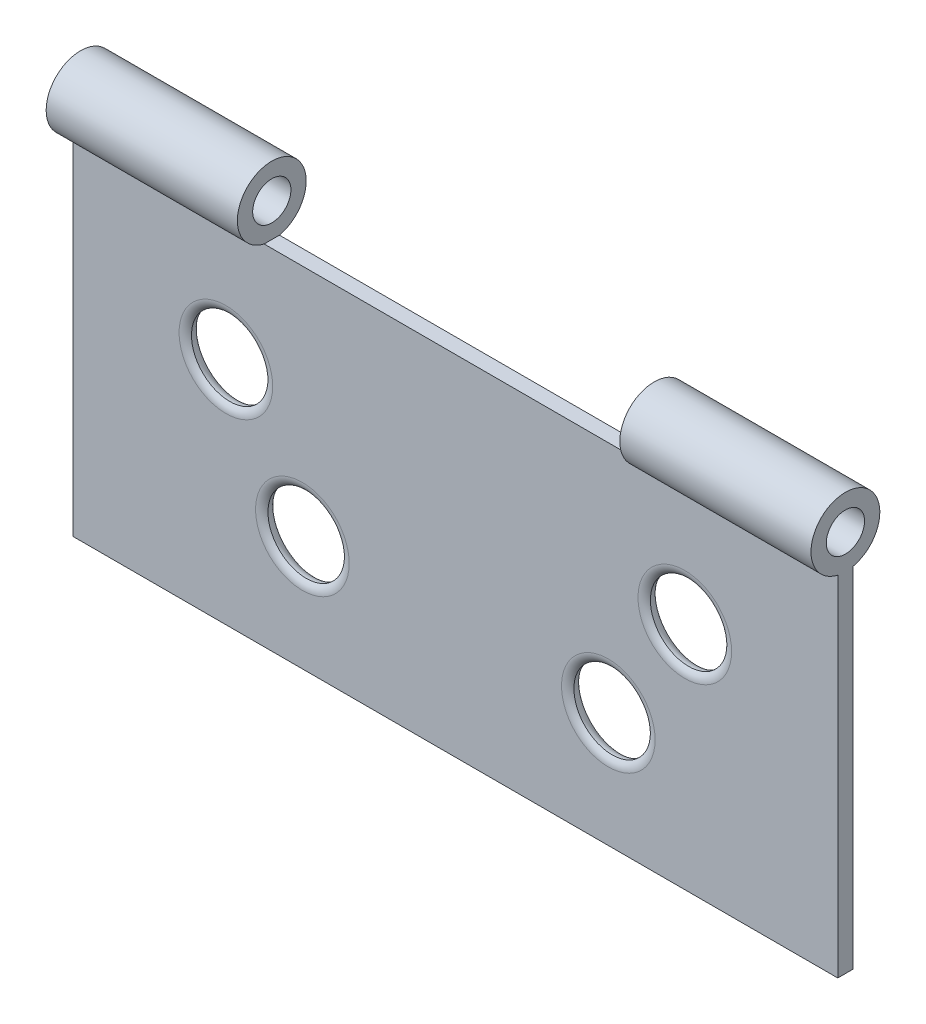
ISO-10303-21;
HEADER;
FILE_DESCRIPTION(('STEP AP214'),'2;1');
FILE_NAME('part.step','',(''),(''),'','','');
FILE_SCHEMA(('AUTOMOTIVE_DESIGN { 1 0 10303 214 1 1 1 1 }'));
ENDSEC;
DATA;
#1=APPLICATION_CONTEXT('core data for automotive mechanical design processes');
#2=APPLICATION_PROTOCOL_DEFINITION('international standard','automotive_design',2000,#1);
#3=PRODUCT_CONTEXT('',#1,'mechanical');
#4=PRODUCT('Part','Part','',(#3));
#5=PRODUCT_RELATED_PRODUCT_CATEGORY('part','',(#4));
#6=PRODUCT_DEFINITION_FORMATION('','',#4);
#7=PRODUCT_DEFINITION_CONTEXT('part definition',#1,'design');
#8=PRODUCT_DEFINITION('design','',#6,#7);
#9=PRODUCT_DEFINITION_SHAPE('','',#8);
#10=(LENGTH_UNIT() NAMED_UNIT(*) SI_UNIT(.MILLI.,.METRE.));
#11=(NAMED_UNIT(*) PLANE_ANGLE_UNIT() SI_UNIT($,.RADIAN.));
#12=(NAMED_UNIT(*) SI_UNIT($,.STERADIAN.) SOLID_ANGLE_UNIT());
#13=UNCERTAINTY_MEASURE_WITH_UNIT(LENGTH_MEASURE(1.E-05),#10,'distance_accuracy_value','');
#14=(GEOMETRIC_REPRESENTATION_CONTEXT(3) GLOBAL_UNCERTAINTY_ASSIGNED_CONTEXT((#13)) GLOBAL_UNIT_ASSIGNED_CONTEXT((#10,
#11,#12)) REPRESENTATION_CONTEXT('',''));
#15=CARTESIAN_POINT('',(0.,0.,0.));
#16=DIRECTION('',(0.,0.,1.));
#17=DIRECTION('',(1.,0.,0.));
#18=AXIS2_PLACEMENT_3D('',#15,#16,#17);
#19=CARTESIAN_POINT('',(-19.6928853558979,8.1864989832161,0.1));
#20=DIRECTION('',(1.,0.,0.));
#21=DIRECTION('',(0.,0.,-1.));
#22=AXIS2_PLACEMENT_3D('',#19,#20,#21);
#23=CYLINDRICAL_SURFACE('',#22,0.450000000000002);
#24=DIRECTION('',(1.,0.,0.));
#25=VECTOR('',#24,1.);
#26=CARTESIAN_POINT('',(-19.6928853558979,7.74775076384649,0.2));
#27=LINE('',#26,#25);
#28=CARTESIAN_POINT('',(-19.6928853558979,7.74775076384649,0.2));
#29=VERTEX_POINT('',#28);
#30=CARTESIAN_POINT('',(-17.1928853558979,7.74775076384649,0.199999999999999));
#31=VERTEX_POINT('',#30);
#32=EDGE_CURVE('E132',#29,#31,#27,.T.);
#33=ORIENTED_EDGE('',*,*,#32,.T.);
#34=CARTESIAN_POINT('',(-17.1928853558979,8.1864989832161,0.1));
#35=DIRECTION('',(1.,0.,0.));
#36=DIRECTION('',(0.,0.,-1.));
#37=AXIS2_PLACEMENT_3D('',#34,#35,#36);
#38=CIRCLE('',#37,0.450000000000002);
#39=CARTESIAN_POINT('',(-17.1928853558979,7.74775076384649,0.));
#40=VERTEX_POINT('',#39);
#41=EDGE_CURVE('E119',#31,#40,#38,.F.);
#42=ORIENTED_EDGE('',*,*,#41,.T.);
#43=DIRECTION('',(1.,0.,0.));
#44=VECTOR('',#43,1.);
#45=CARTESIAN_POINT('',(-19.6928853558979,7.74775076384649,0.));
#46=LINE('',#45,#44);
#47=CARTESIAN_POINT('',(-19.6928853558979,7.74775076384649,0.));
#48=VERTEX_POINT('',#47);
#49=EDGE_CURVE('E11',#48,#40,#46,.T.);
#50=ORIENTED_EDGE('',*,*,#49,.F.);
#51=CARTESIAN_POINT('',(-19.6928853558979,8.1864989832161,0.1));
#52=DIRECTION('',(1.,0.,0.));
#53=DIRECTION('',(0.,0.,-1.));
#54=AXIS2_PLACEMENT_3D('',#51,#52,#53);
#55=CIRCLE('',#54,0.450000000000002);
#56=EDGE_CURVE('E128',#48,#29,#55,.T.);
#57=ORIENTED_EDGE('',*,*,#56,.T.);
#58=EDGE_LOOP('',(#33,#42,#50,#57));
#59=FACE_BOUND('',#58,.T.);
#60=ADVANCED_FACE('F34',(#59),#23,.T.);
#61=CARTESIAN_POINT('',(-19.6928853558979,8.1864989832161,0.1));
#62=DIRECTION('',(1.,0.,0.));
#63=DIRECTION('',(0.,0.,-1.));
#64=AXIS2_PLACEMENT_3D('',#61,#62,#63);
#65=CYLINDRICAL_SURFACE('',#64,0.250000000000001);
#66=CARTESIAN_POINT('',(-19.6928853558979,8.1864989832161,0.1));
#67=DIRECTION('',(1.,0.,0.));
#68=DIRECTION('',(0.,0.,-1.));
#69=AXIS2_PLACEMENT_3D('',#66,#67,#68);
#70=CIRCLE('',#69,0.250000000000001);
#71=CARTESIAN_POINT('',(-19.6928853558979,8.1864989832161,-0.150000000000001));
#72=VERTEX_POINT('',#71);
#73=EDGE_CURVE('E123',#72,#72,#70,.T.);
#74=ORIENTED_EDGE('',*,*,#73,.F.);
#75=EDGE_LOOP('',(#74));
#76=FACE_BOUND('',#75,.T.);
#77=CARTESIAN_POINT('',(-17.1928853558979,8.1864989832161,0.1));
#78=DIRECTION('',(1.,0.,0.));
#79=DIRECTION('',(0.,0.,-1.));
#80=AXIS2_PLACEMENT_3D('',#77,#78,#79);
#81=CIRCLE('',#80,0.250000000000001);
#82=CARTESIAN_POINT('',(-17.1928853558979,8.1864989832161,-0.150000000000001));
#83=VERTEX_POINT('',#82);
#84=EDGE_CURVE('E38',#83,#83,#81,.F.);
#85=ORIENTED_EDGE('',*,*,#84,.F.);
#86=EDGE_LOOP('',(#85));
#87=FACE_BOUND('',#86,.T.);
#88=ADVANCED_FACE('F222',(#76,#87),#65,.F.);
#89=CARTESIAN_POINT('',(-19.6928853558979,0.,0.2));
#90=DIRECTION('',(1.,0.,0.));
#91=DIRECTION('',(0.,0.,-1.));
#92=AXIS2_PLACEMENT_3D('',#89,#90,#91);
#93=PLANE('',#92);
#94=DIRECTION('',(0.,-1.,0.));
#95=VECTOR('',#94,1.);
#96=CARTESIAN_POINT('',(-19.6928853558979,0.,0.2));
#97=LINE('',#96,#95);
#98=CARTESIAN_POINT('',(-19.6928853558979,3.1864989832161,0.2));
#99=VERTEX_POINT('',#98);
#100=EDGE_CURVE('E135',#29,#99,#97,.T.);
#101=ORIENTED_EDGE('',*,*,#100,.F.);
#102=ORIENTED_EDGE('',*,*,#56,.F.);
#103=DIRECTION('',(0.,-1.,0.));
#104=VECTOR('',#103,1.);
#105=CARTESIAN_POINT('',(-19.6928853558979,0.,0.));
#106=LINE('',#105,#104);
#107=CARTESIAN_POINT('',(-19.6928853558979,3.1864989832161,0.));
#108=VERTEX_POINT('',#107);
#109=EDGE_CURVE('E58',#48,#108,#106,.T.);
#110=ORIENTED_EDGE('',*,*,#109,.T.);
#111=DIRECTION('',(0.,0.,-1.));
#112=VECTOR('',#111,1.);
#113=CARTESIAN_POINT('',(-19.6928853558979,3.1864989832161,0.2));
#114=LINE('',#113,#112);
#115=EDGE_CURVE('E150',#99,#108,#114,.T.);
#116=ORIENTED_EDGE('',*,*,#115,.F.);
#117=EDGE_LOOP('',(#101,#102,#110,#116));
#118=FACE_BOUND('',#117,.T.);
#119=ORIENTED_EDGE('',*,*,#73,.T.);
#120=EDGE_LOOP('',(#119));
#121=FACE_BOUND('',#120,.T.);
#122=ADVANCED_FACE('F228',(#118,#121),#93,.F.);
#123=CARTESIAN_POINT('',(-9.69288535589785,0.,0.2));
#124=DIRECTION('',(1.,0.,0.));
#125=DIRECTION('',(0.,0.,-1.));
#126=AXIS2_PLACEMENT_3D('',#123,#124,#125);
#127=PLANE('',#126);
#128=DIRECTION('',(0.,-1.,0.));
#129=VECTOR('',#128,1.);
#130=CARTESIAN_POINT('',(-9.69288535589785,0.,0.));
#131=LINE('',#130,#129);
#132=CARTESIAN_POINT('',(-9.69288535589785,7.74775076384649,0.));
#133=VERTEX_POINT('',#132);
#134=CARTESIAN_POINT('',(-9.69288535589785,3.1864989832161,0.));
#135=VERTEX_POINT('',#134);
#136=EDGE_CURVE('E138',#133,#135,#131,.T.);
#137=ORIENTED_EDGE('',*,*,#136,.F.);
#138=CARTESIAN_POINT('',(-9.69288535589785,8.1864989832161,0.1));
#139=DIRECTION('',(1.,0.,0.));
#140=DIRECTION('',(0.,0.,-1.));
#141=AXIS2_PLACEMENT_3D('',#138,#139,#140);
#142=CIRCLE('',#141,0.450000000000002);
#143=CARTESIAN_POINT('',(-9.69288535589785,7.74775076384649,0.2));
#144=VERTEX_POINT('',#143);
#145=EDGE_CURVE('E108',#133,#144,#142,.T.);
#146=ORIENTED_EDGE('',*,*,#145,.T.);
#147=DIRECTION('',(0.,-1.,0.));
#148=VECTOR('',#147,1.);
#149=CARTESIAN_POINT('',(-9.69288535589785,0.,0.2));
#150=LINE('',#149,#148);
#151=CARTESIAN_POINT('',(-9.69288535589785,3.1864989832161,0.2));
#152=VERTEX_POINT('',#151);
#153=EDGE_CURVE('E141',#144,#152,#150,.T.);
#154=ORIENTED_EDGE('',*,*,#153,.T.);
#155=DIRECTION('',(0.,0.,-1.));
#156=VECTOR('',#155,1.);
#157=CARTESIAN_POINT('',(-9.69288535589785,3.1864989832161,0.2));
#158=LINE('',#157,#156);
#159=EDGE_CURVE('E143',#152,#135,#158,.T.);
#160=ORIENTED_EDGE('',*,*,#159,.T.);
#161=EDGE_LOOP('',(#137,#146,#154,#160));
#162=FACE_BOUND('',#161,.T.);
#163=CARTESIAN_POINT('',(-9.69288535589785,8.1864989832161,0.1));
#164=DIRECTION('',(1.,0.,0.));
#165=DIRECTION('',(0.,0.,-1.));
#166=AXIS2_PLACEMENT_3D('',#163,#164,#165);
#167=CIRCLE('',#166,0.250000000000001);
#168=CARTESIAN_POINT('',(-9.69288535589785,8.1864989832161,-0.150000000000001));
#169=VERTEX_POINT('',#168);
#170=EDGE_CURVE('E122',#169,#169,#167,.T.);
#171=ORIENTED_EDGE('',*,*,#170,.F.);
#172=EDGE_LOOP('',(#171));
#173=FACE_BOUND('',#172,.T.);
#174=ADVANCED_FACE('F266',(#162,#173),#127,.T.);
#175=CARTESIAN_POINT('',(0.,3.1864989832161,0.2));
#176=DIRECTION('',(0.,-1.,0.));
#177=DIRECTION('',(0.,0.,-1.));
#178=AXIS2_PLACEMENT_3D('',#175,#176,#177);
#179=PLANE('',#178);
#180=DIRECTION('',(-1.,0.,0.));
#181=VECTOR('',#180,1.);
#182=CARTESIAN_POINT('',(0.,3.1864989832161,0.));
#183=LINE('',#182,#181);
#184=EDGE_CURVE('E145',#135,#108,#183,.T.);
#185=ORIENTED_EDGE('',*,*,#184,.F.);
#186=ORIENTED_EDGE('',*,*,#159,.F.);
#187=DIRECTION('',(-1.,0.,0.));
#188=VECTOR('',#187,1.);
#189=CARTESIAN_POINT('',(0.,3.1864989832161,0.2));
#190=LINE('',#189,#188);
#191=EDGE_CURVE('E137',#152,#99,#190,.T.);
#192=ORIENTED_EDGE('',*,*,#191,.T.);
#193=ORIENTED_EDGE('',*,*,#115,.T.);
#194=EDGE_LOOP('',(#185,#186,#192,#193));
#195=FACE_BOUND('',#194,.T.);
#196=ADVANCED_FACE('F216',(#195),#179,.T.);
#197=CARTESIAN_POINT('',(0.,0.,0.2));
#198=DIRECTION('',(0.,0.,1.));
#199=DIRECTION('',(1.,0.,0.));
#200=AXIS2_PLACEMENT_3D('',#197,#198,#199);
#201=PLANE('',#200);
#202=ORIENTED_EDGE('',*,*,#32,.F.);
#203=ORIENTED_EDGE('',*,*,#100,.T.);
#204=ORIENTED_EDGE('',*,*,#191,.F.);
#205=ORIENTED_EDGE('',*,*,#153,.F.);
#206=CARTESIAN_POINT('',(-12.1928853558979,7.74775076384649,0.2));
#207=VERTEX_POINT('',#206);
#208=EDGE_CURVE('E130',#207,#144,#27,.T.);
#209=ORIENTED_EDGE('',*,*,#208,.F.);
#210=EDGE_CURVE('E102',#31,#207,#27,.T.);
#211=ORIENTED_EDGE('',*,*,#210,.F.);
#212=EDGE_LOOP('',(#202,#203,#204,#205,#209,#211));
#213=FACE_BOUND('',#212,.T.);
#214=CARTESIAN_POINT('',(-11.6928853558979,6.18958373985024,0.2));
#215=DIRECTION('',(0.,0.,1.));
#216=DIRECTION('',(1.,0.,0.));
#217=AXIS2_PLACEMENT_3D('',#214,#215,#216);
#218=CIRCLE('',#217,0.61180339887499);
#219=CARTESIAN_POINT('',(-11.0810819570229,6.18958373985024,0.2));
#220=VERTEX_POINT('',#219);
#221=EDGE_CURVE('E110',#220,#220,#218,.F.);
#222=ORIENTED_EDGE('',*,*,#221,.T.);
#223=EDGE_LOOP('',(#222));
#224=FACE_BOUND('',#223,.T.);
#225=CARTESIAN_POINT('',(-12.6928853558979,4.68804136153317,0.2));
#226=DIRECTION('',(0.,0.,1.));
#227=DIRECTION('',(1.,0.,0.));
#228=AXIS2_PLACEMENT_3D('',#225,#226,#227);
#229=CIRCLE('',#228,0.61180339887499);
#230=CARTESIAN_POINT('',(-12.0810819570229,4.68804136153317,0.2));
#231=VERTEX_POINT('',#230);
#232=EDGE_CURVE('E182',#231,#231,#229,.F.);
#233=ORIENTED_EDGE('',*,*,#232,.T.);
#234=EDGE_LOOP('',(#233));
#235=FACE_BOUND('',#234,.T.);
#236=CARTESIAN_POINT('',(-17.6928853558979,6.18958373985024,0.2));
#237=DIRECTION('',(0.,0.,1.));
#238=DIRECTION('',(1.,0.,0.));
#239=AXIS2_PLACEMENT_3D('',#236,#237,#238);
#240=CIRCLE('',#239,0.611803398874989);
#241=CARTESIAN_POINT('',(-17.0810819570229,6.18958373985024,0.2));
#242=VERTEX_POINT('',#241);
#243=EDGE_CURVE('E180',#242,#242,#240,.F.);
#244=ORIENTED_EDGE('',*,*,#243,.T.);
#245=EDGE_LOOP('',(#244));
#246=FACE_BOUND('',#245,.T.);
#247=CARTESIAN_POINT('',(-16.6928853558979,4.6864989832161,0.2));
#248=DIRECTION('',(0.,0.,1.));
#249=DIRECTION('',(1.,0.,0.));
#250=AXIS2_PLACEMENT_3D('',#247,#248,#249);
#251=CIRCLE('',#250,0.611803398874989);
#252=CARTESIAN_POINT('',(-16.0810819570229,4.6864989832161,0.2));
#253=VERTEX_POINT('',#252);
#254=EDGE_CURVE('E177',#253,#253,#251,.F.);
#255=ORIENTED_EDGE('',*,*,#254,.T.);
#256=EDGE_LOOP('',(#255));
#257=FACE_BOUND('',#256,.T.);
#258=ADVANCED_FACE('F189',(#213,#224,#235,#246,#257),#201,.T.);
#259=CARTESIAN_POINT('',(0.,0.,0.));
#260=DIRECTION('',(0.,0.,1.));
#261=DIRECTION('',(1.,0.,0.));
#262=AXIS2_PLACEMENT_3D('',#259,#260,#261);
#263=PLANE('',#262);
#264=CARTESIAN_POINT('',(-16.6928853558979,4.6864989832161,0.));
#265=DIRECTION('',(0.,0.,1.));
#266=DIRECTION('',(1.,0.,0.));
#267=AXIS2_PLACEMENT_3D('',#264,#265,#266);
#268=CIRCLE('',#267,0.649999999999999);
#269=CARTESIAN_POINT('',(-16.0428853558979,4.6864989832161,0.));
#270=VERTEX_POINT('',#269);
#271=EDGE_CURVE('E162',#270,#270,#268,.T.);
#272=ORIENTED_EDGE('',*,*,#271,.T.);
#273=EDGE_LOOP('',(#272));
#274=FACE_BOUND('',#273,.T.);
#275=CARTESIAN_POINT('',(-17.6928853558979,6.18958373985024,0.));
#276=DIRECTION('',(0.,0.,1.));
#277=DIRECTION('',(1.,0.,0.));
#278=AXIS2_PLACEMENT_3D('',#275,#276,#277);
#279=CIRCLE('',#278,0.649999999999999);
#280=CARTESIAN_POINT('',(-17.0428853558979,6.18958373985024,0.));
#281=VERTEX_POINT('',#280);
#282=EDGE_CURVE('E159',#281,#281,#279,.T.);
#283=ORIENTED_EDGE('',*,*,#282,.T.);
#284=EDGE_LOOP('',(#283));
#285=FACE_BOUND('',#284,.T.);
#286=CARTESIAN_POINT('',(-12.6928853558979,4.68804136153317,0.));
#287=DIRECTION('',(0.,0.,1.));
#288=DIRECTION('',(1.,0.,0.));
#289=AXIS2_PLACEMENT_3D('',#286,#287,#288);
#290=CIRCLE('',#289,0.650000000000001);
#291=CARTESIAN_POINT('',(-12.0428853558979,4.68804136153317,0.));
#292=VERTEX_POINT('',#291);
#293=EDGE_CURVE('E156',#292,#292,#290,.T.);
#294=ORIENTED_EDGE('',*,*,#293,.T.);
#295=EDGE_LOOP('',(#294));
#296=FACE_BOUND('',#295,.T.);
#297=CARTESIAN_POINT('',(-11.6928853558979,6.18958373985024,0.));
#298=DIRECTION('',(0.,0.,1.));
#299=DIRECTION('',(1.,0.,0.));
#300=AXIS2_PLACEMENT_3D('',#297,#298,#299);
#301=CIRCLE('',#300,0.650000000000001);
#302=CARTESIAN_POINT('',(-11.0428853558979,6.18958373985024,0.));
#303=VERTEX_POINT('',#302);
#304=EDGE_CURVE('E153',#303,#303,#301,.T.);
#305=ORIENTED_EDGE('',*,*,#304,.T.);
#306=EDGE_LOOP('',(#305));
#307=FACE_BOUND('',#306,.T.);
#308=ORIENTED_EDGE('',*,*,#109,.F.);
#309=ORIENTED_EDGE('',*,*,#49,.T.);
#310=CARTESIAN_POINT('',(-12.1928853558979,7.74775076384649,0.));
#311=VERTEX_POINT('',#310);
#312=EDGE_CURVE('E43',#40,#311,#46,.T.);
#313=ORIENTED_EDGE('',*,*,#312,.T.);
#314=EDGE_CURVE('E45',#311,#133,#46,.T.);
#315=ORIENTED_EDGE('',*,*,#314,.T.);
#316=ORIENTED_EDGE('',*,*,#136,.T.);
#317=ORIENTED_EDGE('',*,*,#184,.T.);
#318=EDGE_LOOP('',(#308,#309,#313,#315,#316,#317));
#319=FACE_BOUND('',#318,.T.);
#320=ADVANCED_FACE('F111',(#274,#285,#296,#307,#319),#263,.F.);
#321=CARTESIAN_POINT('',(-16.6928853558979,4.6864989832161,0.15));
#322=DIRECTION('',(0.,0.,1.));
#323=DIRECTION('',(1.,0.,0.));
#324=AXIS2_PLACEMENT_3D('',#321,#322,#323);
#325=TOROIDAL_SURFACE('',#324,0.649999999999999,0.15);
#326=CARTESIAN_POINT('',(-16.6928853558979,4.6864989832161,0.15));
#327=DIRECTION('',(0.,0.,1.));
#328=DIRECTION('',(1.,0.,0.));
#329=AXIS2_PLACEMENT_3D('',#326,#327,#328);
#330=CIRCLE('',#329,0.499999999999999);
#331=CARTESIAN_POINT('',(-16.1928853558979,4.6864989832161,0.15));
#332=VERTEX_POINT('',#331);
#333=EDGE_CURVE('E165',#332,#332,#330,.F.);
#334=ORIENTED_EDGE('',*,*,#333,.F.);
#335=EDGE_LOOP('',(#334));
#336=FACE_BOUND('',#335,.T.);
#337=ORIENTED_EDGE('',*,*,#271,.F.);
#338=EDGE_LOOP('',(#337));
#339=FACE_BOUND('',#338,.T.);
#340=ADVANCED_FACE('F206',(#336,#339),#325,.T.);
#341=CARTESIAN_POINT('',(-17.6928853558979,6.18958373985024,0.15));
#342=DIRECTION('',(0.,0.,1.));
#343=DIRECTION('',(1.,0.,0.));
#344=AXIS2_PLACEMENT_3D('',#341,#342,#343);
#345=TOROIDAL_SURFACE('',#344,0.649999999999999,0.15);
#346=CARTESIAN_POINT('',(-17.6928853558979,6.18958373985024,0.15));
#347=DIRECTION('',(0.,0.,1.));
#348=DIRECTION('',(1.,0.,0.));
#349=AXIS2_PLACEMENT_3D('',#346,#347,#348);
#350=CIRCLE('',#349,0.499999999999999);
#351=CARTESIAN_POINT('',(-17.1928853558979,6.18958373985024,0.15));
#352=VERTEX_POINT('',#351);
#353=EDGE_CURVE('E168',#352,#352,#350,.F.);
#354=ORIENTED_EDGE('',*,*,#353,.F.);
#355=EDGE_LOOP('',(#354));
#356=FACE_BOUND('',#355,.T.);
#357=ORIENTED_EDGE('',*,*,#282,.F.);
#358=EDGE_LOOP('',(#357));
#359=FACE_BOUND('',#358,.T.);
#360=ADVANCED_FACE('F213',(#356,#359),#345,.T.);
#361=CARTESIAN_POINT('',(-12.6928853558979,4.68804136153317,0.15));
#362=DIRECTION('',(0.,0.,1.));
#363=DIRECTION('',(1.,0.,0.));
#364=AXIS2_PLACEMENT_3D('',#361,#362,#363);
#365=TOROIDAL_SURFACE('',#364,0.650000000000001,0.15);
#366=CARTESIAN_POINT('',(-12.6928853558979,4.68804136153317,0.15));
#367=DIRECTION('',(0.,0.,1.));
#368=DIRECTION('',(1.,0.,0.));
#369=AXIS2_PLACEMENT_3D('',#366,#367,#368);
#370=CIRCLE('',#369,0.500000000000001);
#371=CARTESIAN_POINT('',(-12.1928853558979,4.68804136153317,0.15));
#372=VERTEX_POINT('',#371);
#373=EDGE_CURVE('E171',#372,#372,#370,.F.);
#374=ORIENTED_EDGE('',*,*,#373,.F.);
#375=EDGE_LOOP('',(#374));
#376=FACE_BOUND('',#375,.T.);
#377=ORIENTED_EDGE('',*,*,#293,.F.);
#378=EDGE_LOOP('',(#377));
#379=FACE_BOUND('',#378,.T.);
#380=ADVANCED_FACE('F201',(#376,#379),#365,.T.);
#381=CARTESIAN_POINT('',(-11.6928853558979,6.18958373985024,0.15));
#382=DIRECTION('',(0.,0.,1.));
#383=DIRECTION('',(1.,0.,0.));
#384=AXIS2_PLACEMENT_3D('',#381,#382,#383);
#385=TOROIDAL_SURFACE('',#384,0.650000000000001,0.15);
#386=CARTESIAN_POINT('',(-11.6928853558979,6.18958373985024,0.15));
#387=DIRECTION('',(0.,0.,1.));
#388=DIRECTION('',(1.,0.,0.));
#389=AXIS2_PLACEMENT_3D('',#386,#387,#388);
#390=CIRCLE('',#389,0.500000000000001);
#391=CARTESIAN_POINT('',(-11.1928853558979,6.18958373985024,0.15));
#392=VERTEX_POINT('',#391);
#393=EDGE_CURVE('E174',#392,#392,#390,.F.);
#394=ORIENTED_EDGE('',*,*,#393,.F.);
#395=EDGE_LOOP('',(#394));
#396=FACE_BOUND('',#395,.T.);
#397=ORIENTED_EDGE('',*,*,#304,.F.);
#398=EDGE_LOOP('',(#397));
#399=FACE_BOUND('',#398,.T.);
#400=ADVANCED_FACE('F195',(#396,#399),#385,.T.);
#401=CARTESIAN_POINT('',(-11.6928853558979,6.18958373985024,0.05));
#402=DIRECTION('',(0.,0.,1.));
#403=DIRECTION('',(1.,0.,0.));
#404=AXIS2_PLACEMENT_3D('',#401,#402,#403);
#405=TOROIDAL_SURFACE('',#404,0.61180339887499,0.15);
#406=ORIENTED_EDGE('',*,*,#221,.F.);
#407=EDGE_LOOP('',(#406));
#408=FACE_BOUND('',#407,.T.);
#409=ORIENTED_EDGE('',*,*,#393,.T.);
#410=EDGE_LOOP('',(#409));
#411=FACE_BOUND('',#410,.T.);
#412=ADVANCED_FACE('F191',(#408,#411),#405,.T.);
#413=CARTESIAN_POINT('',(-12.6928853558979,4.68804136153317,0.05));
#414=DIRECTION('',(0.,0.,1.));
#415=DIRECTION('',(1.,0.,0.));
#416=AXIS2_PLACEMENT_3D('',#413,#414,#415);
#417=TOROIDAL_SURFACE('',#416,0.61180339887499,0.15);
#418=ORIENTED_EDGE('',*,*,#232,.F.);
#419=EDGE_LOOP('',(#418));
#420=FACE_BOUND('',#419,.T.);
#421=ORIENTED_EDGE('',*,*,#373,.T.);
#422=EDGE_LOOP('',(#421));
#423=FACE_BOUND('',#422,.T.);
#424=ADVANCED_FACE('F194',(#420,#423),#417,.T.);
#425=CARTESIAN_POINT('',(-17.6928853558979,6.18958373985024,0.05));
#426=DIRECTION('',(0.,0.,1.));
#427=DIRECTION('',(1.,0.,0.));
#428=AXIS2_PLACEMENT_3D('',#425,#426,#427);
#429=TOROIDAL_SURFACE('',#428,0.611803398874989,0.15);
#430=ORIENTED_EDGE('',*,*,#243,.F.);
#431=EDGE_LOOP('',(#430));
#432=FACE_BOUND('',#431,.T.);
#433=ORIENTED_EDGE('',*,*,#353,.T.);
#434=EDGE_LOOP('',(#433));
#435=FACE_BOUND('',#434,.T.);
#436=ADVANCED_FACE('F238',(#432,#435),#429,.T.);
#437=CARTESIAN_POINT('',(-16.6928853558979,4.6864989832161,0.05));
#438=DIRECTION('',(0.,0.,1.));
#439=DIRECTION('',(1.,0.,0.));
#440=AXIS2_PLACEMENT_3D('',#437,#438,#439);
#441=TOROIDAL_SURFACE('',#440,0.611803398874989,0.15);
#442=ORIENTED_EDGE('',*,*,#254,.F.);
#443=EDGE_LOOP('',(#442));
#444=FACE_BOUND('',#443,.T.);
#445=ORIENTED_EDGE('',*,*,#333,.T.);
#446=EDGE_LOOP('',(#445));
#447=FACE_BOUND('',#446,.T.);
#448=ADVANCED_FACE('F36',(#444,#447),#441,.T.);
#449=CARTESIAN_POINT('',(-12.1928853558979,8.1864989832161,0.1));
#450=DIRECTION('',(1.,0.,0.));
#451=DIRECTION('',(0.,0.,-1.));
#452=AXIS2_PLACEMENT_3D('',#449,#450,#451);
#453=CIRCLE('',#452,0.450000000000002);
#454=EDGE_CURVE('E88',#207,#311,#453,.F.);
#455=ORIENTED_EDGE('',*,*,#454,.F.);
#456=ORIENTED_EDGE('',*,*,#208,.T.);
#457=ORIENTED_EDGE('',*,*,#145,.F.);
#458=ORIENTED_EDGE('',*,*,#314,.F.);
#459=EDGE_LOOP('',(#455,#456,#457,#458));
#460=FACE_BOUND('',#459,.T.);
#461=ADVANCED_FACE('F106',(#460),#23,.T.);
#462=CARTESIAN_POINT('',(-12.1928853558979,8.1864989832161,0.1));
#463=DIRECTION('',(1.,0.,0.));
#464=DIRECTION('',(0.,0.,-1.));
#465=AXIS2_PLACEMENT_3D('',#462,#463,#464);
#466=CIRCLE('',#465,0.250000000000001);
#467=CARTESIAN_POINT('',(-12.1928853558979,8.1864989832161,-0.150000000000001));
#468=VERTEX_POINT('',#467);
#469=EDGE_CURVE('E94',#468,#468,#466,.F.);
#470=ORIENTED_EDGE('',*,*,#469,.T.);
#471=EDGE_LOOP('',(#470));
#472=FACE_BOUND('',#471,.T.);
#473=ORIENTED_EDGE('',*,*,#170,.T.);
#474=EDGE_LOOP('',(#473));
#475=FACE_BOUND('',#474,.T.);
#476=ADVANCED_FACE('F231',(#472,#475),#65,.F.);
#477=CARTESIAN_POINT('',(-17.1928853558979,0.,-10.));
#478=DIRECTION('',(1.,0.,0.));
#479=DIRECTION('',(0.,0.,-1.));
#480=AXIS2_PLACEMENT_3D('',#477,#478,#479);
#481=PLANE('',#480);
#482=DIRECTION('',(0.,0.,1.));
#483=VECTOR('',#482,1.);
#484=CARTESIAN_POINT('',(-17.1928853558979,7.74775076384649,-10.));
#485=LINE('',#484,#483);
#486=EDGE_CURVE('E103',#40,#31,#485,.T.);
#487=ORIENTED_EDGE('',*,*,#486,.F.);
#488=ORIENTED_EDGE('',*,*,#41,.F.);
#489=EDGE_LOOP('',(#487,#488));
#490=FACE_BOUND('',#489,.T.);
#491=ORIENTED_EDGE('',*,*,#84,.T.);
#492=EDGE_LOOP('',(#491));
#493=FACE_BOUND('',#492,.T.);
#494=ADVANCED_FACE('F237',(#490,#493),#481,.T.);
#495=CARTESIAN_POINT('',(-12.1928853558979,0.,-10.));
#496=DIRECTION('',(1.,0.,0.));
#497=DIRECTION('',(0.,0.,-1.));
#498=AXIS2_PLACEMENT_3D('',#495,#496,#497);
#499=PLANE('',#498);
#500=ORIENTED_EDGE('',*,*,#454,.T.);
#501=DIRECTION('',(0.,0.,1.));
#502=VECTOR('',#501,1.);
#503=CARTESIAN_POINT('',(-12.1928853558979,7.74775076384649,-10.));
#504=LINE('',#503,#502);
#505=EDGE_CURVE('E51',#311,#207,#504,.T.);
#506=ORIENTED_EDGE('',*,*,#505,.T.);
#507=EDGE_LOOP('',(#500,#506));
#508=FACE_BOUND('',#507,.T.);
#509=ORIENTED_EDGE('',*,*,#469,.F.);
#510=EDGE_LOOP('',(#509));
#511=FACE_BOUND('',#510,.T.);
#512=ADVANCED_FACE('F89',(#508,#511),#499,.F.);
#513=CARTESIAN_POINT('',(0.,7.74775076384649,-10.));
#514=DIRECTION('',(0.,-1.,0.));
#515=DIRECTION('',(0.,0.,-1.));
#516=AXIS2_PLACEMENT_3D('',#513,#514,#515);
#517=PLANE('',#516);
#518=ORIENTED_EDGE('',*,*,#312,.F.);
#519=ORIENTED_EDGE('',*,*,#486,.T.);
#520=ORIENTED_EDGE('',*,*,#210,.T.);
#521=ORIENTED_EDGE('',*,*,#505,.F.);
#522=EDGE_LOOP('',(#518,#519,#520,#521));
#523=FACE_BOUND('',#522,.T.);
#524=ADVANCED_FACE('F97',(#523),#517,.F.);
#525=CLOSED_SHELL('',(#60,#88,#122,#174,#196,#258,#320,#340,#360,#380,#400,#412,#424,#436,#448,
#461,#476,#494,#512,#524));
#526=MANIFOLD_SOLID_BREP('B2',#525);
#527=ADVANCED_BREP_SHAPE_REPRESENTATION('',(#18,#526),#14);
#528=SHAPE_DEFINITION_REPRESENTATION(#9,#527);
ENDSEC;
END-ISO-10303-21;
